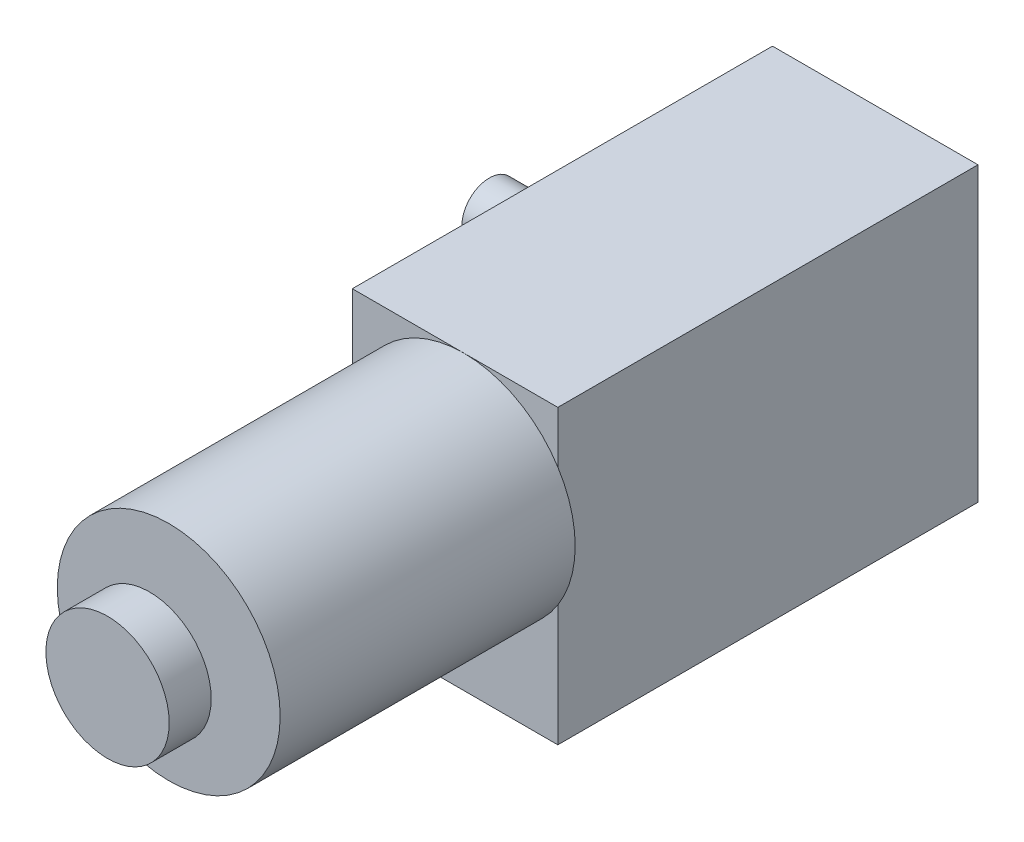
ISO-10303-21;
HEADER;
FILE_DESCRIPTION(('STEP AP214'),'2;1');
FILE_NAME('part.step','',(''),(''),'','','');
FILE_SCHEMA(('AUTOMOTIVE_DESIGN { 1 0 10303 214 1 1 1 1 }'));
ENDSEC;
DATA;
#1=APPLICATION_CONTEXT('core data for automotive mechanical design processes');
#2=APPLICATION_PROTOCOL_DEFINITION('international standard','automotive_design',2000,#1);
#3=PRODUCT_CONTEXT('',#1,'mechanical');
#4=PRODUCT('Part','Part','',(#3));
#5=PRODUCT_RELATED_PRODUCT_CATEGORY('part','',(#4));
#6=PRODUCT_DEFINITION_FORMATION('','',#4);
#7=PRODUCT_DEFINITION_CONTEXT('part definition',#1,'design');
#8=PRODUCT_DEFINITION('design','',#6,#7);
#9=PRODUCT_DEFINITION_SHAPE('','',#8);
#10=(LENGTH_UNIT() NAMED_UNIT(*) SI_UNIT(.MILLI.,.METRE.));
#11=(NAMED_UNIT(*) PLANE_ANGLE_UNIT() SI_UNIT($,.RADIAN.));
#12=(NAMED_UNIT(*) SI_UNIT($,.STERADIAN.) SOLID_ANGLE_UNIT());
#13=UNCERTAINTY_MEASURE_WITH_UNIT(LENGTH_MEASURE(1.E-05),#10,'distance_accuracy_value','');
#14=(GEOMETRIC_REPRESENTATION_CONTEXT(3) GLOBAL_UNCERTAINTY_ASSIGNED_CONTEXT((#13)) GLOBAL_UNIT_ASSIGNED_CONTEXT((#10,
#11,#12)) REPRESENTATION_CONTEXT('',''));
#15=CARTESIAN_POINT('',(0.,0.,0.));
#16=DIRECTION('',(0.,0.,1.));
#17=DIRECTION('',(1.,0.,0.));
#18=AXIS2_PLACEMENT_3D('',#15,#16,#17);
#19=CARTESIAN_POINT('',(-12.2,12.2,-46.));
#20=DIRECTION('',(1.,0.,0.));
#21=DIRECTION('',(0.,1.,0.));
#22=AXIS2_PLACEMENT_3D('',#19,#20,#21);
#23=PLANE('',#22);
#24=DIRECTION('',(0.,1.,0.));
#25=VECTOR('',#24,1.);
#26=CARTESIAN_POINT('',(-12.2,12.2,0.));
#27=LINE('',#26,#25);
#28=CARTESIAN_POINT('',(-12.2,-19.8,0.));
#29=VERTEX_POINT('',#28);
#30=CARTESIAN_POINT('',(-12.2,0.,0.));
#31=VERTEX_POINT('',#30);
#32=EDGE_CURVE('E193',#29,#31,#27,.T.);
#33=ORIENTED_EDGE('',*,*,#32,.T.);
#34=CARTESIAN_POINT('',(-12.2,12.2,0.));
#35=VERTEX_POINT('',#34);
#36=EDGE_CURVE('E185',#31,#35,#27,.T.);
#37=ORIENTED_EDGE('',*,*,#36,.T.);
#38=DIRECTION('',(0.,0.,1.));
#39=VECTOR('',#38,1.);
#40=CARTESIAN_POINT('',(-12.2,12.2,-46.));
#41=LINE('',#40,#39);
#42=CARTESIAN_POINT('',(-12.2,12.2,-46.));
#43=VERTEX_POINT('',#42);
#44=EDGE_CURVE('E214',#43,#35,#41,.T.);
#45=ORIENTED_EDGE('',*,*,#44,.F.);
#46=DIRECTION('',(0.,1.,0.));
#47=VECTOR('',#46,1.);
#48=CARTESIAN_POINT('',(-12.2,12.2,-46.));
#49=LINE('',#48,#47);
#50=CARTESIAN_POINT('',(-12.2,-19.8,-46.));
#51=VERTEX_POINT('',#50);
#52=EDGE_CURVE('E181',#51,#43,#49,.T.);
#53=ORIENTED_EDGE('',*,*,#52,.F.);
#54=DIRECTION('',(0.,0.,1.));
#55=VECTOR('',#54,1.);
#56=CARTESIAN_POINT('',(-12.2,-19.8,-46.));
#57=LINE('',#56,#55);
#58=EDGE_CURVE('E194',#51,#29,#57,.T.);
#59=ORIENTED_EDGE('',*,*,#58,.T.);
#60=EDGE_LOOP('',(#33,#37,#45,#53,#59));
#61=FACE_BOUND('',#60,.T.);
#62=CARTESIAN_POINT('',(-12.2,-3.8,-31.));
#63=DIRECTION('',(1.,0.,0.));
#64=DIRECTION('',(0.,1.,0.));
#65=AXIS2_PLACEMENT_3D('',#62,#63,#64);
#66=CIRCLE('',#65,6.5);
#67=CARTESIAN_POINT('',(-12.2,2.7,-31.));
#68=VERTEX_POINT('',#67);
#69=EDGE_CURVE('E240',#68,#68,#66,.F.);
#70=ORIENTED_EDGE('',*,*,#69,.F.);
#71=EDGE_LOOP('',(#70));
#72=FACE_BOUND('',#71,.T.);
#73=CARTESIAN_POINT('',(-12.2,-12.8,-40.));
#74=DIRECTION('',(1.,0.,0.));
#75=DIRECTION('',(0.,1.,0.));
#76=AXIS2_PLACEMENT_3D('',#73,#74,#75);
#77=CIRCLE('',#76,3.7);
#78=CARTESIAN_POINT('',(-12.2,-9.1,-40.));
#79=VERTEX_POINT('',#78);
#80=EDGE_CURVE('E238',#79,#79,#77,.F.);
#81=ORIENTED_EDGE('',*,*,#80,.F.);
#82=EDGE_LOOP('',(#81));
#83=FACE_BOUND('',#82,.T.);
#84=CARTESIAN_POINT('',(-12.2,5.2,-40.));
#85=DIRECTION('',(1.,0.,0.));
#86=DIRECTION('',(0.,1.,0.));
#87=AXIS2_PLACEMENT_3D('',#84,#85,#86);
#88=CIRCLE('',#87,3.7);
#89=CARTESIAN_POINT('',(-12.2,8.9,-40.));
#90=VERTEX_POINT('',#89);
#91=EDGE_CURVE('E244',#90,#90,#88,.F.);
#92=ORIENTED_EDGE('',*,*,#91,.F.);
#93=EDGE_LOOP('',(#92));
#94=FACE_BOUND('',#93,.T.);
#95=CARTESIAN_POINT('',(-12.2,5.2,-7.00000000000001));
#96=DIRECTION('',(1.,0.,0.));
#97=DIRECTION('',(0.,1.,0.));
#98=AXIS2_PLACEMENT_3D('',#95,#96,#97);
#99=CIRCLE('',#98,3.7);
#100=CARTESIAN_POINT('',(-12.2,8.90000000000001,-7.00000000000001));
#101=VERTEX_POINT('',#100);
#102=EDGE_CURVE('E245',#101,#101,#99,.F.);
#103=ORIENTED_EDGE('',*,*,#102,.F.);
#104=EDGE_LOOP('',(#103));
#105=FACE_BOUND('',#104,.T.);
#106=CARTESIAN_POINT('',(-12.2,-12.8,-7.));
#107=DIRECTION('',(1.,0.,0.));
#108=DIRECTION('',(0.,1.,0.));
#109=AXIS2_PLACEMENT_3D('',#106,#107,#108);
#110=CIRCLE('',#109,3.7);
#111=CARTESIAN_POINT('',(-12.2,-9.1,-7.));
#112=VERTEX_POINT('',#111);
#113=EDGE_CURVE('E43',#112,#112,#110,.F.);
#114=ORIENTED_EDGE('',*,*,#113,.F.);
#115=EDGE_LOOP('',(#114));
#116=FACE_BOUND('',#115,.T.);
#117=CARTESIAN_POINT('',(-12.2,-8.8,-18.5));
#118=DIRECTION('',(-1.,0.,0.));
#119=DIRECTION('',(0.,-1.,0.));
#120=AXIS2_PLACEMENT_3D('',#117,#118,#119);
#121=CIRCLE('',#120,1.5);
#122=CARTESIAN_POINT('',(-12.2,-8.8,-20.));
#123=VERTEX_POINT('',#122);
#124=CARTESIAN_POINT('',(-12.2,-8.8,-17.));
#125=VERTEX_POINT('',#124);
#126=EDGE_CURVE('E137',#123,#125,#121,.T.);
#127=ORIENTED_EDGE('',*,*,#126,.F.);
#128=DIRECTION('',(0.,-1.,0.));
#129=VECTOR('',#128,1.);
#130=CARTESIAN_POINT('',(-12.2,-8.8,-20.));
#131=LINE('',#130,#129);
#132=CARTESIAN_POINT('',(-12.2,1.2,-20.));
#133=VERTEX_POINT('',#132);
#134=EDGE_CURVE('E133',#133,#123,#131,.T.);
#135=ORIENTED_EDGE('',*,*,#134,.F.);
#136=CARTESIAN_POINT('',(-12.2,1.2,-18.5));
#137=DIRECTION('',(-1.,0.,0.));
#138=DIRECTION('',(0.,-1.,0.));
#139=AXIS2_PLACEMENT_3D('',#136,#137,#138);
#140=CIRCLE('',#139,1.5);
#141=CARTESIAN_POINT('',(-12.2,1.2,-17.));
#142=VERTEX_POINT('',#141);
#143=EDGE_CURVE('E58',#142,#133,#140,.T.);
#144=ORIENTED_EDGE('',*,*,#143,.F.);
#145=DIRECTION('',(0.,1.,0.));
#146=VECTOR('',#145,1.);
#147=CARTESIAN_POINT('',(-12.2,-8.8,-17.));
#148=LINE('',#147,#146);
#149=EDGE_CURVE('E54',#125,#142,#148,.T.);
#150=ORIENTED_EDGE('',*,*,#149,.F.);
#151=EDGE_LOOP('',(#127,#135,#144,#150));
#152=FACE_BOUND('',#151,.T.);
#153=ADVANCED_FACE('F39',(#61,#72,#83,#94,#105,#116,#152),#23,.F.);
#154=CARTESIAN_POINT('',(0.,0.,0.));
#155=DIRECTION('',(0.,0.,1.));
#156=DIRECTION('',(1.,0.,0.));
#157=AXIS2_PLACEMENT_3D('',#154,#155,#156);
#158=PLANE('',#157);
#159=DIRECTION('',(0.,-1.,0.));
#160=VECTOR('',#159,1.);
#161=CARTESIAN_POINT('',(10.3,12.2,0.));
#162=LINE('',#161,#160);
#163=CARTESIAN_POINT('',(10.3,6.53834841531101,0.));
#164=VERTEX_POINT('',#163);
#165=CARTESIAN_POINT('',(10.3,-6.53834841531101,0.));
#166=VERTEX_POINT('',#165);
#167=EDGE_CURVE('E202',#164,#166,#162,.T.);
#168=ORIENTED_EDGE('',*,*,#167,.F.);
#169=CARTESIAN_POINT('',(0.,0.,0.));
#170=DIRECTION('',(0.,0.,1.));
#171=DIRECTION('',(1.,0.,0.));
#172=AXIS2_PLACEMENT_3D('',#169,#170,#171);
#173=CIRCLE('',#172,12.2);
#174=EDGE_CURVE('E227',#166,#164,#173,.T.);
#175=ORIENTED_EDGE('',*,*,#174,.F.);
#176=EDGE_LOOP('',(#168,#175));
#177=FACE_BOUND('',#176,.T.);
#178=ADVANCED_FACE('F254',(#177),#158,.F.);
#179=CARTESIAN_POINT('',(0.,0.,32.3));
#180=DIRECTION('',(0.,0.,-1.));
#181=DIRECTION('',(-1.,0.,0.));
#182=AXIS2_PLACEMENT_3D('',#179,#180,#181);
#183=CYLINDRICAL_SURFACE('',#182,12.2);
#184=CARTESIAN_POINT('',(0.,0.,32.3));
#185=DIRECTION('',(0.,0.,1.));
#186=DIRECTION('',(1.,0.,0.));
#187=AXIS2_PLACEMENT_3D('',#184,#185,#186);
#188=CIRCLE('',#187,12.2);
#189=CARTESIAN_POINT('',(12.2,0.,32.3));
#190=VERTEX_POINT('',#189);
#191=EDGE_CURVE('E231',#190,#190,#188,.T.);
#192=ORIENTED_EDGE('',*,*,#191,.F.);
#193=EDGE_LOOP('',(#192));
#194=FACE_BOUND('',#193,.T.);
#195=CARTESIAN_POINT('',(0.,12.2,0.));
#196=VERTEX_POINT('',#195);
#197=EDGE_CURVE('E233',#164,#196,#173,.T.);
#198=ORIENTED_EDGE('',*,*,#197,.T.);
#199=EDGE_CURVE('E237',#196,#31,#173,.T.);
#200=ORIENTED_EDGE('',*,*,#199,.T.);
#201=EDGE_CURVE('E406',#31,#166,#173,.T.);
#202=ORIENTED_EDGE('',*,*,#201,.T.);
#203=ORIENTED_EDGE('',*,*,#174,.T.);
#204=EDGE_LOOP('',(#198,#200,#202,#203));
#205=FACE_BOUND('',#204,.T.);
#206=ADVANCED_FACE('F41',(#194,#205),#183,.T.);
#207=CARTESIAN_POINT('',(0.,0.,32.3));
#208=DIRECTION('',(0.,0.,1.));
#209=DIRECTION('',(1.,0.,0.));
#210=AXIS2_PLACEMENT_3D('',#207,#208,#209);
#211=PLANE('',#210);
#212=CARTESIAN_POINT('',(0.,0.,32.3));
#213=DIRECTION('',(0.,0.,1.));
#214=DIRECTION('',(1.,0.,0.));
#215=AXIS2_PLACEMENT_3D('',#212,#213,#214);
#216=CIRCLE('',#215,2.05);
#217=CARTESIAN_POINT('',(2.05,0.,32.3));
#218=VERTEX_POINT('',#217);
#219=EDGE_CURVE('E229',#218,#218,#216,.T.);
#220=ORIENTED_EDGE('',*,*,#219,.F.);
#221=EDGE_LOOP('',(#220));
#222=FACE_BOUND('',#221,.T.);
#223=ORIENTED_EDGE('',*,*,#191,.T.);
#224=EDGE_LOOP('',(#223));
#225=FACE_BOUND('',#224,.T.);
#226=ADVANCED_FACE('F389',(#222,#225),#211,.T.);
#227=CARTESIAN_POINT('',(0.,0.,34.4));
#228=DIRECTION('',(0.,0.,-1.));
#229=DIRECTION('',(-1.,0.,0.));
#230=AXIS2_PLACEMENT_3D('',#227,#228,#229);
#231=CYLINDRICAL_SURFACE('',#230,2.05);
#232=CARTESIAN_POINT('',(0.,0.,34.4));
#233=DIRECTION('',(0.,0.,1.));
#234=DIRECTION('',(1.,0.,0.));
#235=AXIS2_PLACEMENT_3D('',#232,#233,#234);
#236=CIRCLE('',#235,2.05);
#237=CARTESIAN_POINT('',(2.05,0.,34.4));
#238=VERTEX_POINT('',#237);
#239=EDGE_CURVE('E225',#238,#238,#236,.T.);
#240=ORIENTED_EDGE('',*,*,#239,.F.);
#241=EDGE_LOOP('',(#240));
#242=FACE_BOUND('',#241,.T.);
#243=ORIENTED_EDGE('',*,*,#219,.T.);
#244=EDGE_LOOP('',(#243));
#245=FACE_BOUND('',#244,.T.);
#246=ADVANCED_FACE('F383',(#242,#245),#231,.T.);
#247=CARTESIAN_POINT('',(0.,0.,39.));
#248=DIRECTION('',(0.,0.,-1.));
#249=DIRECTION('',(-1.,0.,0.));
#250=AXIS2_PLACEMENT_3D('',#247,#248,#249);
#251=CYLINDRICAL_SURFACE('',#250,6.75);
#252=CARTESIAN_POINT('',(0.,0.,39.));
#253=DIRECTION('',(0.,0.,1.));
#254=DIRECTION('',(1.,0.,0.));
#255=AXIS2_PLACEMENT_3D('',#252,#253,#254);
#256=CIRCLE('',#255,6.75);
#257=CARTESIAN_POINT('',(6.75,0.,39.));
#258=VERTEX_POINT('',#257);
#259=EDGE_CURVE('E218',#258,#258,#256,.T.);
#260=ORIENTED_EDGE('',*,*,#259,.F.);
#261=EDGE_LOOP('',(#260));
#262=FACE_BOUND('',#261,.T.);
#263=CARTESIAN_POINT('',(0.,0.,34.4));
#264=DIRECTION('',(0.,0.,1.));
#265=DIRECTION('',(1.,0.,0.));
#266=AXIS2_PLACEMENT_3D('',#263,#264,#265);
#267=CIRCLE('',#266,6.75);
#268=CARTESIAN_POINT('',(6.75,0.,34.4));
#269=VERTEX_POINT('',#268);
#270=EDGE_CURVE('E217',#269,#269,#267,.T.);
#271=ORIENTED_EDGE('',*,*,#270,.T.);
#272=EDGE_LOOP('',(#271));
#273=FACE_BOUND('',#272,.T.);
#274=ADVANCED_FACE('F380',(#262,#273),#251,.T.);
#275=CARTESIAN_POINT('',(0.,0.,39.));
#276=DIRECTION('',(0.,0.,1.));
#277=DIRECTION('',(1.,0.,0.));
#278=AXIS2_PLACEMENT_3D('',#275,#276,#277);
#279=PLANE('',#278);
#280=ORIENTED_EDGE('',*,*,#259,.T.);
#281=EDGE_LOOP('',(#280));
#282=FACE_BOUND('',#281,.T.);
#283=ADVANCED_FACE('F372',(#282),#279,.T.);
#284=CARTESIAN_POINT('',(0.,0.,34.4));
#285=DIRECTION('',(0.,0.,1.));
#286=DIRECTION('',(1.,0.,0.));
#287=AXIS2_PLACEMENT_3D('',#284,#285,#286);
#288=PLANE('',#287);
#289=ORIENTED_EDGE('',*,*,#239,.T.);
#290=EDGE_LOOP('',(#289));
#291=FACE_BOUND('',#290,.T.);
#292=ORIENTED_EDGE('',*,*,#270,.F.);
#293=EDGE_LOOP('',(#292));
#294=FACE_BOUND('',#293,.T.);
#295=ADVANCED_FACE('F360',(#291,#294),#288,.F.);
#296=CARTESIAN_POINT('',(0.,0.,0.));
#297=DIRECTION('',(0.,0.,1.));
#298=DIRECTION('',(1.,0.,0.));
#299=AXIS2_PLACEMENT_3D('',#296,#297,#298);
#300=PLANE('',#299);
#301=ORIENTED_EDGE('',*,*,#197,.F.);
#302=CARTESIAN_POINT('',(10.3,12.2,0.));
#303=VERTEX_POINT('',#302);
#304=EDGE_CURVE('E205',#303,#164,#162,.T.);
#305=ORIENTED_EDGE('',*,*,#304,.F.);
#306=DIRECTION('',(1.,0.,0.));
#307=VECTOR('',#306,1.);
#308=CARTESIAN_POINT('',(-12.2,12.2,0.));
#309=LINE('',#308,#307);
#310=EDGE_CURVE('E197',#196,#303,#309,.T.);
#311=ORIENTED_EDGE('',*,*,#310,.F.);
#312=EDGE_LOOP('',(#301,#305,#311));
#313=FACE_BOUND('',#312,.T.);
#314=ADVANCED_FACE('F356',(#313),#300,.T.);
#315=ORIENTED_EDGE('',*,*,#199,.F.);
#316=EDGE_CURVE('E196',#35,#196,#309,.T.);
#317=ORIENTED_EDGE('',*,*,#316,.F.);
#318=ORIENTED_EDGE('',*,*,#36,.F.);
#319=EDGE_LOOP('',(#315,#317,#318));
#320=FACE_BOUND('',#319,.T.);
#321=ADVANCED_FACE('F358',(#320),#300,.T.);
#322=ORIENTED_EDGE('',*,*,#201,.F.);
#323=ORIENTED_EDGE('',*,*,#32,.F.);
#324=DIRECTION('',(-1.,0.,0.));
#325=VECTOR('',#324,1.);
#326=CARTESIAN_POINT('',(-12.2,-19.8,0.));
#327=LINE('',#326,#325);
#328=CARTESIAN_POINT('',(10.3,-19.8,0.));
#329=VERTEX_POINT('',#328);
#330=EDGE_CURVE('E187',#329,#29,#327,.T.);
#331=ORIENTED_EDGE('',*,*,#330,.F.);
#332=EDGE_CURVE('E203',#166,#329,#162,.T.);
#333=ORIENTED_EDGE('',*,*,#332,.F.);
#334=EDGE_LOOP('',(#322,#323,#331,#333));
#335=FACE_BOUND('',#334,.T.);
#336=ADVANCED_FACE('F362',(#335),#300,.T.);
#337=CARTESIAN_POINT('',(-12.2,12.2,-46.));
#338=DIRECTION('',(0.,-1.,0.));
#339=DIRECTION('',(1.,0.,0.));
#340=AXIS2_PLACEMENT_3D('',#337,#338,#339);
#341=PLANE('',#340);
#342=ORIENTED_EDGE('',*,*,#316,.T.);
#343=ORIENTED_EDGE('',*,*,#310,.T.);
#344=DIRECTION('',(0.,0.,1.));
#345=VECTOR('',#344,1.);
#346=CARTESIAN_POINT('',(10.3,12.2,-46.));
#347=LINE('',#346,#345);
#348=CARTESIAN_POINT('',(10.3,12.2,-46.));
#349=VERTEX_POINT('',#348);
#350=EDGE_CURVE('E215',#349,#303,#347,.T.);
#351=ORIENTED_EDGE('',*,*,#350,.F.);
#352=DIRECTION('',(1.,0.,0.));
#353=VECTOR('',#352,1.);
#354=CARTESIAN_POINT('',(-12.2,12.2,-46.));
#355=LINE('',#354,#353);
#356=EDGE_CURVE('E186',#43,#349,#355,.T.);
#357=ORIENTED_EDGE('',*,*,#356,.F.);
#358=ORIENTED_EDGE('',*,*,#44,.T.);
#359=EDGE_LOOP('',(#342,#343,#351,#357,#358));
#360=FACE_BOUND('',#359,.T.);
#361=ADVANCED_FACE('F369',(#360),#341,.F.);
#362=CARTESIAN_POINT('',(10.3,12.2,-46.));
#363=DIRECTION('',(-1.,0.,0.));
#364=DIRECTION('',(0.,-1.,0.));
#365=AXIS2_PLACEMENT_3D('',#362,#363,#364);
#366=PLANE('',#365);
#367=ORIENTED_EDGE('',*,*,#304,.T.);
#368=ORIENTED_EDGE('',*,*,#167,.T.);
#369=ORIENTED_EDGE('',*,*,#332,.T.);
#370=DIRECTION('',(0.,0.,1.));
#371=VECTOR('',#370,1.);
#372=CARTESIAN_POINT('',(10.3,-19.8,-46.));
#373=LINE('',#372,#371);
#374=CARTESIAN_POINT('',(10.3,-19.8,-46.));
#375=VERTEX_POINT('',#374);
#376=EDGE_CURVE('E207',#375,#329,#373,.T.);
#377=ORIENTED_EDGE('',*,*,#376,.F.);
#378=DIRECTION('',(0.,-1.,0.));
#379=VECTOR('',#378,1.);
#380=CARTESIAN_POINT('',(10.3,12.2,-46.));
#381=LINE('',#380,#379);
#382=EDGE_CURVE('E188',#349,#375,#381,.T.);
#383=ORIENTED_EDGE('',*,*,#382,.F.);
#384=ORIENTED_EDGE('',*,*,#350,.T.);
#385=EDGE_LOOP('',(#367,#368,#369,#377,#383,#384));
#386=FACE_BOUND('',#385,.T.);
#387=ADVANCED_FACE('F364',(#386),#366,.F.);
#388=CARTESIAN_POINT('',(-12.2,-19.8,-46.));
#389=DIRECTION('',(0.,1.,0.));
#390=DIRECTION('',(0.,0.,1.));
#391=AXIS2_PLACEMENT_3D('',#388,#389,#390);
#392=PLANE('',#391);
#393=ORIENTED_EDGE('',*,*,#330,.T.);
#394=ORIENTED_EDGE('',*,*,#58,.F.);
#395=DIRECTION('',(-1.,0.,0.));
#396=VECTOR('',#395,1.);
#397=CARTESIAN_POINT('',(-12.2,-19.8,-46.));
#398=LINE('',#397,#396);
#399=EDGE_CURVE('E191',#375,#51,#398,.T.);
#400=ORIENTED_EDGE('',*,*,#399,.F.);
#401=ORIENTED_EDGE('',*,*,#376,.T.);
#402=EDGE_LOOP('',(#393,#394,#400,#401));
#403=FACE_BOUND('',#402,.T.);
#404=ADVANCED_FACE('F353',(#403),#392,.F.);
#405=CARTESIAN_POINT('',(0.,0.,-46.));
#406=DIRECTION('',(0.,0.,1.));
#407=DIRECTION('',(1.,0.,0.));
#408=AXIS2_PLACEMENT_3D('',#405,#406,#407);
#409=PLANE('',#408);
#410=ORIENTED_EDGE('',*,*,#52,.T.);
#411=ORIENTED_EDGE('',*,*,#356,.T.);
#412=ORIENTED_EDGE('',*,*,#382,.T.);
#413=ORIENTED_EDGE('',*,*,#399,.T.);
#414=EDGE_LOOP('',(#410,#411,#412,#413));
#415=FACE_BOUND('',#414,.T.);
#416=ADVANCED_FACE('F314',(#415),#409,.F.);
#417=CARTESIAN_POINT('',(-14.2,-3.8,-31.));
#418=DIRECTION('',(1.,0.,0.));
#419=DIRECTION('',(0.,1.,0.));
#420=AXIS2_PLACEMENT_3D('',#417,#418,#419);
#421=CYLINDRICAL_SURFACE('',#420,6.5);
#422=CARTESIAN_POINT('',(-14.2,-3.8,-31.));
#423=DIRECTION('',(-1.,0.,0.));
#424=DIRECTION('',(0.,-1.,0.));
#425=AXIS2_PLACEMENT_3D('',#422,#423,#424);
#426=CIRCLE('',#425,6.5);
#427=CARTESIAN_POINT('',(-14.2,-10.3,-31.));
#428=VERTEX_POINT('',#427);
#429=EDGE_CURVE('E178',#428,#428,#426,.T.);
#430=ORIENTED_EDGE('',*,*,#429,.F.);
#431=EDGE_LOOP('',(#430));
#432=FACE_BOUND('',#431,.T.);
#433=ORIENTED_EDGE('',*,*,#69,.T.);
#434=EDGE_LOOP('',(#433));
#435=FACE_BOUND('',#434,.T.);
#436=ADVANCED_FACE('F306',(#432,#435),#421,.T.);
#437=CARTESIAN_POINT('',(-14.2,-3.8,-31.));
#438=DIRECTION('',(-1.,0.,0.));
#439=DIRECTION('',(0.,-1.,0.));
#440=AXIS2_PLACEMENT_3D('',#437,#438,#439);
#441=PLANE('',#440);
#442=CARTESIAN_POINT('',(-14.2,-3.8,-31.));
#443=DIRECTION('',(-1.,0.,0.));
#444=DIRECTION('',(0.,-1.,0.));
#445=AXIS2_PLACEMENT_3D('',#442,#443,#444);
#446=CIRCLE('',#445,3.);
#447=CARTESIAN_POINT('',(-14.2,-6.8,-31.));
#448=VERTEX_POINT('',#447);
#449=EDGE_CURVE('E11',#448,#448,#446,.T.);
#450=ORIENTED_EDGE('',*,*,#449,.F.);
#451=EDGE_LOOP('',(#450));
#452=FACE_BOUND('',#451,.T.);
#453=ORIENTED_EDGE('',*,*,#429,.T.);
#454=EDGE_LOOP('',(#453));
#455=FACE_BOUND('',#454,.T.);
#456=ADVANCED_FACE('F303',(#452,#455),#441,.T.);
#457=CARTESIAN_POINT('',(-14.2,-12.8,-40.));
#458=DIRECTION('',(-1.,0.,0.));
#459=DIRECTION('',(0.,-1.,0.));
#460=AXIS2_PLACEMENT_3D('',#457,#458,#459);
#461=PLANE('',#460);
#462=CARTESIAN_POINT('',(-14.2,-12.8,-40.));
#463=DIRECTION('',(-1.,0.,0.));
#464=DIRECTION('',(0.,-1.,0.));
#465=AXIS2_PLACEMENT_3D('',#462,#463,#464);
#466=CIRCLE('',#465,3.7);
#467=CARTESIAN_POINT('',(-14.2,-16.5,-40.));
#468=VERTEX_POINT('',#467);
#469=EDGE_CURVE('E173',#468,#468,#466,.T.);
#470=ORIENTED_EDGE('',*,*,#469,.T.);
#471=EDGE_LOOP('',(#470));
#472=FACE_BOUND('',#471,.T.);
#473=CARTESIAN_POINT('',(-14.2,-12.8,-40.));
#474=DIRECTION('',(-1.,0.,0.));
#475=DIRECTION('',(0.,-1.,0.));
#476=AXIS2_PLACEMENT_3D('',#473,#474,#475);
#477=CIRCLE('',#476,1.5);
#478=CARTESIAN_POINT('',(-14.2,-14.3,-40.));
#479=VERTEX_POINT('',#478);
#480=EDGE_CURVE('E171',#479,#479,#477,.T.);
#481=ORIENTED_EDGE('',*,*,#480,.F.);
#482=EDGE_LOOP('',(#481));
#483=FACE_BOUND('',#482,.T.);
#484=ADVANCED_FACE('F307',(#472,#483),#461,.T.);
#485=CARTESIAN_POINT('',(-14.2,-12.8,-40.));
#486=DIRECTION('',(1.,0.,0.));
#487=DIRECTION('',(0.,1.,0.));
#488=AXIS2_PLACEMENT_3D('',#485,#486,#487);
#489=CYLINDRICAL_SURFACE('',#488,3.7);
#490=ORIENTED_EDGE('',*,*,#469,.F.);
#491=EDGE_LOOP('',(#490));
#492=FACE_BOUND('',#491,.T.);
#493=ORIENTED_EDGE('',*,*,#80,.T.);
#494=EDGE_LOOP('',(#493));
#495=FACE_BOUND('',#494,.T.);
#496=ADVANCED_FACE('F343',(#492,#495),#489,.T.);
#497=CARTESIAN_POINT('',(-14.2,-12.8,-40.));
#498=DIRECTION('',(1.,0.,0.));
#499=DIRECTION('',(0.,1.,0.));
#500=AXIS2_PLACEMENT_3D('',#497,#498,#499);
#501=CYLINDRICAL_SURFACE('',#500,1.5);
#502=ORIENTED_EDGE('',*,*,#480,.T.);
#503=EDGE_LOOP('',(#502));
#504=FACE_BOUND('',#503,.T.);
#505=CARTESIAN_POINT('',(-12.2,-12.8,-40.));
#506=DIRECTION('',(-1.,0.,0.));
#507=DIRECTION('',(0.,-1.,0.));
#508=AXIS2_PLACEMENT_3D('',#505,#506,#507);
#509=CIRCLE('',#508,1.5);
#510=CARTESIAN_POINT('',(-12.2,-14.3,-40.));
#511=VERTEX_POINT('',#510);
#512=EDGE_CURVE('E168',#511,#511,#509,.T.);
#513=ORIENTED_EDGE('',*,*,#512,.F.);
#514=EDGE_LOOP('',(#513));
#515=FACE_BOUND('',#514,.T.);
#516=ADVANCED_FACE('F341',(#504,#515),#501,.F.);
#517=ORIENTED_EDGE('',*,*,#512,.T.);
#518=EDGE_LOOP('',(#517));
#519=FACE_BOUND('',#518,.T.);
#520=ADVANCED_FACE('F259',(#519),#23,.F.);
#521=CARTESIAN_POINT('',(-14.2,5.2,-40.));
#522=DIRECTION('',(1.,0.,0.));
#523=DIRECTION('',(0.,1.,0.));
#524=AXIS2_PLACEMENT_3D('',#521,#522,#523);
#525=PLANE('',#524);
#526=CARTESIAN_POINT('',(-14.2,5.2,-40.));
#527=DIRECTION('',(-1.,0.,0.));
#528=DIRECTION('',(0.,1.,0.));
#529=AXIS2_PLACEMENT_3D('',#526,#527,#528);
#530=CIRCLE('',#529,3.7);
#531=CARTESIAN_POINT('',(-14.2,8.9,-40.));
#532=VERTEX_POINT('',#531);
#533=EDGE_CURVE('E164',#532,#532,#530,.T.);
#534=ORIENTED_EDGE('',*,*,#533,.T.);
#535=EDGE_LOOP('',(#534));
#536=FACE_BOUND('',#535,.T.);
#537=CARTESIAN_POINT('',(-14.2,5.2,-40.));
#538=DIRECTION('',(-1.,0.,0.));
#539=DIRECTION('',(0.,1.,0.));
#540=AXIS2_PLACEMENT_3D('',#537,#538,#539);
#541=CIRCLE('',#540,1.5);
#542=CARTESIAN_POINT('',(-14.2,6.7,-40.));
#543=VERTEX_POINT('',#542);
#544=EDGE_CURVE('E165',#543,#543,#541,.T.);
#545=ORIENTED_EDGE('',*,*,#544,.F.);
#546=EDGE_LOOP('',(#545));
#547=FACE_BOUND('',#546,.T.);
#548=ADVANCED_FACE('F330',(#536,#547),#525,.F.);
#549=CARTESIAN_POINT('',(-14.2,5.2,-40.));
#550=DIRECTION('',(1.,0.,0.));
#551=DIRECTION('',(0.,1.,0.));
#552=AXIS2_PLACEMENT_3D('',#549,#550,#551);
#553=CYLINDRICAL_SURFACE('',#552,3.7);
#554=ORIENTED_EDGE('',*,*,#533,.F.);
#555=EDGE_LOOP('',(#554));
#556=FACE_BOUND('',#555,.T.);
#557=ORIENTED_EDGE('',*,*,#91,.T.);
#558=EDGE_LOOP('',(#557));
#559=FACE_BOUND('',#558,.T.);
#560=ADVANCED_FACE('F322',(#556,#559),#553,.T.);
#561=CARTESIAN_POINT('',(-14.2,5.2,-40.));
#562=DIRECTION('',(1.,0.,0.));
#563=DIRECTION('',(0.,1.,0.));
#564=AXIS2_PLACEMENT_3D('',#561,#562,#563);
#565=CYLINDRICAL_SURFACE('',#564,1.5);
#566=ORIENTED_EDGE('',*,*,#544,.T.);
#567=EDGE_LOOP('',(#566));
#568=FACE_BOUND('',#567,.T.);
#569=CARTESIAN_POINT('',(-12.2,5.2,-40.));
#570=DIRECTION('',(-1.,0.,0.));
#571=DIRECTION('',(0.,1.,0.));
#572=AXIS2_PLACEMENT_3D('',#569,#570,#571);
#573=CIRCLE('',#572,1.5);
#574=CARTESIAN_POINT('',(-12.2,6.7,-40.));
#575=VERTEX_POINT('',#574);
#576=EDGE_CURVE('E161',#575,#575,#573,.T.);
#577=ORIENTED_EDGE('',*,*,#576,.F.);
#578=EDGE_LOOP('',(#577));
#579=FACE_BOUND('',#578,.T.);
#580=ADVANCED_FACE('F326',(#568,#579),#565,.F.);
#581=ORIENTED_EDGE('',*,*,#576,.T.);
#582=EDGE_LOOP('',(#581));
#583=FACE_BOUND('',#582,.T.);
#584=ADVANCED_FACE('F331',(#583),#23,.F.);
#585=CARTESIAN_POINT('',(-14.2,5.2,-7.00000000000001));
#586=DIRECTION('',(-1.,0.,0.));
#587=DIRECTION('',(0.,-1.,0.));
#588=AXIS2_PLACEMENT_3D('',#585,#586,#587);
#589=PLANE('',#588);
#590=CARTESIAN_POINT('',(-14.2,5.2,-7.00000000000001));
#591=DIRECTION('',(-1.,0.,0.));
#592=DIRECTION('',(0.,-1.,0.));
#593=AXIS2_PLACEMENT_3D('',#590,#591,#592);
#594=CIRCLE('',#593,3.7);
#595=CARTESIAN_POINT('',(-14.2,1.5,-7.00000000000001));
#596=VERTEX_POINT('',#595);
#597=EDGE_CURVE('E156',#596,#596,#594,.T.);
#598=ORIENTED_EDGE('',*,*,#597,.T.);
#599=EDGE_LOOP('',(#598));
#600=FACE_BOUND('',#599,.T.);
#601=CARTESIAN_POINT('',(-14.2,5.2,-7.00000000000001));
#602=DIRECTION('',(-1.,0.,0.));
#603=DIRECTION('',(0.,-1.,0.));
#604=AXIS2_PLACEMENT_3D('',#601,#602,#603);
#605=CIRCLE('',#604,1.5);
#606=CARTESIAN_POINT('',(-14.2,3.7,-7.00000000000001));
#607=VERTEX_POINT('',#606);
#608=EDGE_CURVE('E153',#607,#607,#605,.T.);
#609=ORIENTED_EDGE('',*,*,#608,.F.);
#610=EDGE_LOOP('',(#609));
#611=FACE_BOUND('',#610,.T.);
#612=ADVANCED_FACE('F487',(#600,#611),#589,.T.);
#613=CARTESIAN_POINT('',(-14.2,5.2,-7.00000000000001));
#614=DIRECTION('',(1.,0.,0.));
#615=DIRECTION('',(0.,1.,0.));
#616=AXIS2_PLACEMENT_3D('',#613,#614,#615);
#617=CYLINDRICAL_SURFACE('',#616,3.7);
#618=ORIENTED_EDGE('',*,*,#597,.F.);
#619=EDGE_LOOP('',(#618));
#620=FACE_BOUND('',#619,.T.);
#621=ORIENTED_EDGE('',*,*,#102,.T.);
#622=EDGE_LOOP('',(#621));
#623=FACE_BOUND('',#622,.T.);
#624=ADVANCED_FACE('F552',(#620,#623),#617,.T.);
#625=CARTESIAN_POINT('',(-14.2,5.2,-7.00000000000001));
#626=DIRECTION('',(1.,0.,0.));
#627=DIRECTION('',(0.,1.,0.));
#628=AXIS2_PLACEMENT_3D('',#625,#626,#627);
#629=CYLINDRICAL_SURFACE('',#628,1.5);
#630=ORIENTED_EDGE('',*,*,#608,.T.);
#631=EDGE_LOOP('',(#630));
#632=FACE_BOUND('',#631,.T.);
#633=CARTESIAN_POINT('',(-12.2,5.2,-7.00000000000001));
#634=DIRECTION('',(-1.,0.,0.));
#635=DIRECTION('',(0.,-1.,0.));
#636=AXIS2_PLACEMENT_3D('',#633,#634,#635);
#637=CIRCLE('',#636,1.5);
#638=CARTESIAN_POINT('',(-12.2,3.7,-7.00000000000001));
#639=VERTEX_POINT('',#638);
#640=EDGE_CURVE('E155',#639,#639,#637,.T.);
#641=ORIENTED_EDGE('',*,*,#640,.F.);
#642=EDGE_LOOP('',(#641));
#643=FACE_BOUND('',#642,.T.);
#644=ADVANCED_FACE('F496',(#632,#643),#629,.F.);
#645=ORIENTED_EDGE('',*,*,#640,.T.);
#646=EDGE_LOOP('',(#645));
#647=FACE_BOUND('',#646,.T.);
#648=ADVANCED_FACE('F491',(#647),#23,.F.);
#649=CARTESIAN_POINT('',(-14.2,-12.8,-7.));
#650=DIRECTION('',(1.,0.,0.));
#651=DIRECTION('',(0.,1.,0.));
#652=AXIS2_PLACEMENT_3D('',#649,#650,#651);
#653=PLANE('',#652);
#654=CARTESIAN_POINT('',(-14.2,-12.8,-7.));
#655=DIRECTION('',(-1.,0.,0.));
#656=DIRECTION('',(0.,1.,0.));
#657=AXIS2_PLACEMENT_3D('',#654,#655,#656);
#658=CIRCLE('',#657,3.7);
#659=CARTESIAN_POINT('',(-14.2,-9.1,-7.));
#660=VERTEX_POINT('',#659);
#661=EDGE_CURVE('E146',#660,#660,#658,.T.);
#662=ORIENTED_EDGE('',*,*,#661,.T.);
#663=EDGE_LOOP('',(#662));
#664=FACE_BOUND('',#663,.T.);
#665=CARTESIAN_POINT('',(-14.2,-12.8,-7.));
#666=DIRECTION('',(-1.,0.,0.));
#667=DIRECTION('',(0.,1.,0.));
#668=AXIS2_PLACEMENT_3D('',#665,#666,#667);
#669=CIRCLE('',#668,1.5);
#670=CARTESIAN_POINT('',(-14.2,-11.3,-7.));
#671=VERTEX_POINT('',#670);
#672=EDGE_CURVE('E143',#671,#671,#669,.T.);
#673=ORIENTED_EDGE('',*,*,#672,.F.);
#674=EDGE_LOOP('',(#673));
#675=FACE_BOUND('',#674,.T.);
#676=ADVANCED_FACE('F499',(#664,#675),#653,.F.);
#677=CARTESIAN_POINT('',(-14.2,-12.8,-7.));
#678=DIRECTION('',(1.,0.,0.));
#679=DIRECTION('',(0.,1.,0.));
#680=AXIS2_PLACEMENT_3D('',#677,#678,#679);
#681=CYLINDRICAL_SURFACE('',#680,3.7);
#682=ORIENTED_EDGE('',*,*,#661,.F.);
#683=EDGE_LOOP('',(#682));
#684=FACE_BOUND('',#683,.T.);
#685=ORIENTED_EDGE('',*,*,#113,.T.);
#686=EDGE_LOOP('',(#685));
#687=FACE_BOUND('',#686,.T.);
#688=ADVANCED_FACE('F252',(#684,#687),#681,.T.);
#689=CARTESIAN_POINT('',(-14.2,-12.8,-7.));
#690=DIRECTION('',(1.,0.,0.));
#691=DIRECTION('',(0.,1.,0.));
#692=AXIS2_PLACEMENT_3D('',#689,#690,#691);
#693=CYLINDRICAL_SURFACE('',#692,1.5);
#694=ORIENTED_EDGE('',*,*,#672,.T.);
#695=EDGE_LOOP('',(#694));
#696=FACE_BOUND('',#695,.T.);
#697=CARTESIAN_POINT('',(-12.2,-12.8,-7.));
#698=DIRECTION('',(-1.,0.,0.));
#699=DIRECTION('',(0.,1.,0.));
#700=AXIS2_PLACEMENT_3D('',#697,#698,#699);
#701=CIRCLE('',#700,1.5);
#702=CARTESIAN_POINT('',(-12.2,-11.3,-7.));
#703=VERTEX_POINT('',#702);
#704=EDGE_CURVE('E139',#703,#703,#701,.T.);
#705=ORIENTED_EDGE('',*,*,#704,.F.);
#706=EDGE_LOOP('',(#705));
#707=FACE_BOUND('',#706,.T.);
#708=ADVANCED_FACE('F509',(#696,#707),#693,.F.);
#709=ORIENTED_EDGE('',*,*,#704,.T.);
#710=EDGE_LOOP('',(#709));
#711=FACE_BOUND('',#710,.T.);
#712=ADVANCED_FACE('F256',(#711),#23,.F.);
#713=CARTESIAN_POINT('',(-14.2,-8.8,-18.5));
#714=DIRECTION('',(1.,0.,0.));
#715=DIRECTION('',(0.,1.,0.));
#716=AXIS2_PLACEMENT_3D('',#713,#714,#715);
#717=CYLINDRICAL_SURFACE('',#716,1.5);
#718=ORIENTED_EDGE('',*,*,#126,.T.);
#719=DIRECTION('',(1.,0.,0.));
#720=VECTOR('',#719,1.);
#721=CARTESIAN_POINT('',(-14.2,-8.8,-17.));
#722=LINE('',#721,#720);
#723=CARTESIAN_POINT('',(-14.2,-8.8,-17.));
#724=VERTEX_POINT('',#723);
#725=EDGE_CURVE('E119',#724,#125,#722,.T.);
#726=ORIENTED_EDGE('',*,*,#725,.F.);
#727=CARTESIAN_POINT('',(-14.2,-8.8,-18.5));
#728=DIRECTION('',(-1.,0.,0.));
#729=DIRECTION('',(0.,-1.,0.));
#730=AXIS2_PLACEMENT_3D('',#727,#728,#729);
#731=CIRCLE('',#730,1.5);
#732=CARTESIAN_POINT('',(-14.2,-8.8,-20.));
#733=VERTEX_POINT('',#732);
#734=EDGE_CURVE('E125',#733,#724,#731,.T.);
#735=ORIENTED_EDGE('',*,*,#734,.F.);
#736=DIRECTION('',(1.,0.,0.));
#737=VECTOR('',#736,1.);
#738=CARTESIAN_POINT('',(-14.2,-8.8,-20.));
#739=LINE('',#738,#737);
#740=EDGE_CURVE('E266',#733,#123,#739,.T.);
#741=ORIENTED_EDGE('',*,*,#740,.T.);
#742=EDGE_LOOP('',(#718,#726,#735,#741));
#743=FACE_BOUND('',#742,.T.);
#744=ADVANCED_FACE('F136',(#743),#717,.T.);
#745=CARTESIAN_POINT('',(-14.2,-8.8,-17.));
#746=DIRECTION('',(0.,0.,-1.));
#747=DIRECTION('',(-1.,0.,0.));
#748=AXIS2_PLACEMENT_3D('',#745,#746,#747);
#749=PLANE('',#748);
#750=ORIENTED_EDGE('',*,*,#149,.T.);
#751=DIRECTION('',(1.,0.,0.));
#752=VECTOR('',#751,1.);
#753=CARTESIAN_POINT('',(-14.2,1.2,-17.));
#754=LINE('',#753,#752);
#755=CARTESIAN_POINT('',(-14.2,1.2,-17.));
#756=VERTEX_POINT('',#755);
#757=EDGE_CURVE('E121',#756,#142,#754,.T.);
#758=ORIENTED_EDGE('',*,*,#757,.F.);
#759=DIRECTION('',(0.,1.,0.));
#760=VECTOR('',#759,1.);
#761=CARTESIAN_POINT('',(-14.2,-8.8,-17.));
#762=LINE('',#761,#760);
#763=EDGE_CURVE('E111',#724,#756,#762,.T.);
#764=ORIENTED_EDGE('',*,*,#763,.F.);
#765=ORIENTED_EDGE('',*,*,#725,.T.);
#766=EDGE_LOOP('',(#750,#758,#764,#765));
#767=FACE_BOUND('',#766,.T.);
#768=ADVANCED_FACE('F116',(#767),#749,.F.);
#769=CARTESIAN_POINT('',(-14.2,1.2,-18.5));
#770=DIRECTION('',(1.,0.,0.));
#771=DIRECTION('',(0.,1.,0.));
#772=AXIS2_PLACEMENT_3D('',#769,#770,#771);
#773=CYLINDRICAL_SURFACE('',#772,1.5);
#774=ORIENTED_EDGE('',*,*,#143,.T.);
#775=DIRECTION('',(1.,0.,0.));
#776=VECTOR('',#775,1.);
#777=CARTESIAN_POINT('',(-14.2,1.2,-20.));
#778=LINE('',#777,#776);
#779=CARTESIAN_POINT('',(-14.2,1.2,-20.));
#780=VERTEX_POINT('',#779);
#781=EDGE_CURVE('E141',#780,#133,#778,.T.);
#782=ORIENTED_EDGE('',*,*,#781,.F.);
#783=CARTESIAN_POINT('',(-14.2,1.2,-18.5));
#784=DIRECTION('',(-1.,0.,0.));
#785=DIRECTION('',(0.,-1.,0.));
#786=AXIS2_PLACEMENT_3D('',#783,#784,#785);
#787=CIRCLE('',#786,1.5);
#788=EDGE_CURVE('E123',#756,#780,#787,.T.);
#789=ORIENTED_EDGE('',*,*,#788,.F.);
#790=ORIENTED_EDGE('',*,*,#757,.T.);
#791=EDGE_LOOP('',(#774,#782,#789,#790));
#792=FACE_BOUND('',#791,.T.);
#793=ADVANCED_FACE('F596',(#792),#773,.T.);
#794=CARTESIAN_POINT('',(-14.2,-8.8,-20.));
#795=DIRECTION('',(0.,0.,1.));
#796=DIRECTION('',(1.,0.,0.));
#797=AXIS2_PLACEMENT_3D('',#794,#795,#796);
#798=PLANE('',#797);
#799=ORIENTED_EDGE('',*,*,#134,.T.);
#800=ORIENTED_EDGE('',*,*,#740,.F.);
#801=DIRECTION('',(0.,-1.,0.));
#802=VECTOR('',#801,1.);
#803=CARTESIAN_POINT('',(-14.2,-8.8,-20.));
#804=LINE('',#803,#802);
#805=EDGE_CURVE('E128',#780,#733,#804,.T.);
#806=ORIENTED_EDGE('',*,*,#805,.F.);
#807=ORIENTED_EDGE('',*,*,#781,.T.);
#808=EDGE_LOOP('',(#799,#800,#806,#807));
#809=FACE_BOUND('',#808,.T.);
#810=ADVANCED_FACE('F264',(#809),#798,.F.);
#811=CARTESIAN_POINT('',(-14.2,-8.8,-18.5));
#812=DIRECTION('',(-1.,0.,0.));
#813=DIRECTION('',(0.,-1.,0.));
#814=AXIS2_PLACEMENT_3D('',#811,#812,#813);
#815=PLANE('',#814);
#816=ORIENTED_EDGE('',*,*,#734,.T.);
#817=ORIENTED_EDGE('',*,*,#763,.T.);
#818=ORIENTED_EDGE('',*,*,#788,.T.);
#819=ORIENTED_EDGE('',*,*,#805,.T.);
#820=EDGE_LOOP('',(#816,#817,#818,#819));
#821=FACE_BOUND('',#820,.T.);
#822=ADVANCED_FACE('F126',(#821),#815,.T.);
#823=CARTESIAN_POINT('',(-28.2,-3.8,-31.));
#824=DIRECTION('',(1.,0.,0.));
#825=DIRECTION('',(0.,1.,0.));
#826=AXIS2_PLACEMENT_3D('',#823,#824,#825);
#827=CYLINDRICAL_SURFACE('',#826,3.);
#828=CARTESIAN_POINT('',(-28.2,-3.8,-31.));
#829=DIRECTION('',(-1.,0.,0.));
#830=DIRECTION('',(0.,-1.,0.));
#831=AXIS2_PLACEMENT_3D('',#828,#829,#830);
#832=CIRCLE('',#831,3.);
#833=CARTESIAN_POINT('',(-28.2,-6.8,-31.));
#834=VERTEX_POINT('',#833);
#835=EDGE_CURVE('E261',#834,#834,#832,.T.);
#836=ORIENTED_EDGE('',*,*,#835,.F.);
#837=EDGE_LOOP('',(#836));
#838=FACE_BOUND('',#837,.T.);
#839=ORIENTED_EDGE('',*,*,#449,.T.);
#840=EDGE_LOOP('',(#839));
#841=FACE_BOUND('',#840,.T.);
#842=ADVANCED_FACE('F293',(#838,#841),#827,.T.);
#843=CARTESIAN_POINT('',(-28.2,-3.8,-31.));
#844=DIRECTION('',(-1.,0.,0.));
#845=DIRECTION('',(0.,-1.,0.));
#846=AXIS2_PLACEMENT_3D('',#843,#844,#845);
#847=PLANE('',#846);
#848=CARTESIAN_POINT('',(-28.2,-3.8,-31.));
#849=DIRECTION('',(-1.,0.,0.));
#850=DIRECTION('',(0.,-1.,0.));
#851=AXIS2_PLACEMENT_3D('',#848,#849,#850);
#852=CIRCLE('',#851,1.5);
#853=CARTESIAN_POINT('',(-28.2,-5.3,-31.));
#854=VERTEX_POINT('',#853);
#855=EDGE_CURVE('E279',#854,#854,#852,.T.);
#856=ORIENTED_EDGE('',*,*,#855,.F.);
#857=EDGE_LOOP('',(#856));
#858=FACE_BOUND('',#857,.T.);
#859=ORIENTED_EDGE('',*,*,#835,.T.);
#860=EDGE_LOOP('',(#859));
#861=FACE_BOUND('',#860,.T.);
#862=ADVANCED_FACE('F288',(#858,#861),#847,.T.);
#863=CARTESIAN_POINT('',(-20.2,-3.8,-31.));
#864=DIRECTION('',(-1.,0.,0.));
#865=DIRECTION('',(0.,-1.,0.));
#866=AXIS2_PLACEMENT_3D('',#863,#864,#865);
#867=CYLINDRICAL_SURFACE('',#866,1.5);
#868=CARTESIAN_POINT('',(-20.2,-3.8,-31.));
#869=DIRECTION('',(-1.,0.,0.));
#870=DIRECTION('',(0.,-1.,0.));
#871=AXIS2_PLACEMENT_3D('',#868,#869,#870);
#872=CIRCLE('',#871,1.5);
#873=CARTESIAN_POINT('',(-20.2,-5.3,-31.));
#874=VERTEX_POINT('',#873);
#875=EDGE_CURVE('E280',#874,#874,#872,.T.);
#876=ORIENTED_EDGE('',*,*,#875,.F.);
#877=EDGE_LOOP('',(#876));
#878=FACE_BOUND('',#877,.T.);
#879=ORIENTED_EDGE('',*,*,#855,.T.);
#880=EDGE_LOOP('',(#879));
#881=FACE_BOUND('',#880,.T.);
#882=ADVANCED_FACE('F286',(#878,#881),#867,.F.);
#883=CARTESIAN_POINT('',(-20.2,-3.8,-31.));
#884=DIRECTION('',(-1.,0.,0.));
#885=DIRECTION('',(0.,-1.,0.));
#886=AXIS2_PLACEMENT_3D('',#883,#884,#885);
#887=PLANE('',#886);
#888=ORIENTED_EDGE('',*,*,#875,.T.);
#889=EDGE_LOOP('',(#888));
#890=FACE_BOUND('',#889,.T.);
#891=ADVANCED_FACE('F283',(#890),#887,.T.);
#892=CLOSED_SHELL('',(#153,#178,#206,#226,#246,#274,#283,#295,#314,#321,#336,#361,#387,#404,
#416,#436,#456,#484,#496,#516,#520,#548,#560,#580,#584,#612,#624,#644,#648,#676,#688,#708,#712,
#744,#768,#793,#810,#822,#842,#862,#882,#891));
#893=MANIFOLD_SOLID_BREP('B2',#892);
#894=ADVANCED_BREP_SHAPE_REPRESENTATION('',(#18,#893),#14);
#895=SHAPE_DEFINITION_REPRESENTATION(#9,#894);
ENDSEC;
END-ISO-10303-21;
